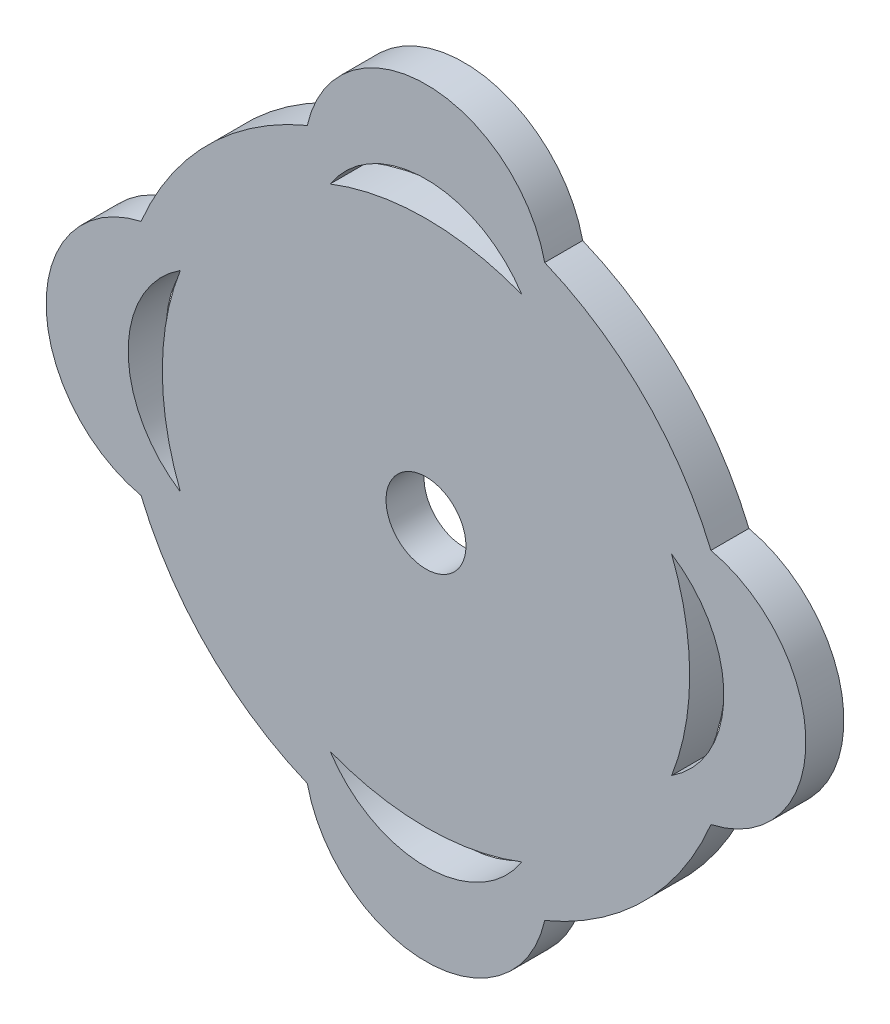
ISO-10303-21;
HEADER;
FILE_DESCRIPTION(('STEP AP214'),'2;1');
FILE_NAME('part.step','',(''),(''),'','','');
FILE_SCHEMA(('AUTOMOTIVE_DESIGN { 1 0 10303 214 1 1 1 1 }'));
ENDSEC;
DATA;
#1=APPLICATION_CONTEXT('core data for automotive mechanical design processes');
#2=APPLICATION_PROTOCOL_DEFINITION('international standard','automotive_design',2000,#1);
#3=PRODUCT_CONTEXT('',#1,'mechanical');
#4=PRODUCT('Part','Part','',(#3));
#5=PRODUCT_RELATED_PRODUCT_CATEGORY('part','',(#4));
#6=PRODUCT_DEFINITION_FORMATION('','',#4);
#7=PRODUCT_DEFINITION_CONTEXT('part definition',#1,'design');
#8=PRODUCT_DEFINITION('design','',#6,#7);
#9=PRODUCT_DEFINITION_SHAPE('','',#8);
#10=(LENGTH_UNIT() NAMED_UNIT(*) SI_UNIT(.MILLI.,.METRE.));
#11=(NAMED_UNIT(*) PLANE_ANGLE_UNIT() SI_UNIT($,.RADIAN.));
#12=(NAMED_UNIT(*) SI_UNIT($,.STERADIAN.) SOLID_ANGLE_UNIT());
#13=UNCERTAINTY_MEASURE_WITH_UNIT(LENGTH_MEASURE(1.E-05),#10,'distance_accuracy_value','');
#14=(GEOMETRIC_REPRESENTATION_CONTEXT(3) GLOBAL_UNCERTAINTY_ASSIGNED_CONTEXT((#13)) GLOBAL_UNIT_ASSIGNED_CONTEXT((#10,
#11,#12)) REPRESENTATION_CONTEXT('',''));
#15=CARTESIAN_POINT('',(0.,0.,0.));
#16=DIRECTION('',(0.,0.,1.));
#17=DIRECTION('',(1.,0.,0.));
#18=AXIS2_PLACEMENT_3D('',#15,#16,#17);
#19=CARTESIAN_POINT('',(0.,0.,1.03632));
#20=DIRECTION('',(0.,0.,1.));
#21=DIRECTION('',(1.,0.,0.));
#22=AXIS2_PLACEMENT_3D('',#19,#20,#21);
#23=PLANE('',#22);
#24=CARTESIAN_POINT('',(0.,0.,1.03632));
#25=DIRECTION('',(0.,0.,1.));
#26=DIRECTION('',(1.,0.,0.));
#27=AXIS2_PLACEMENT_3D('',#24,#25,#26);
#28=CIRCLE('',#27,1.11125);
#29=CARTESIAN_POINT('',(1.11125,0.,1.03632));
#30=VERTEX_POINT('',#29);
#31=EDGE_CURVE('E174',#30,#30,#28,.T.);
#32=ORIENTED_EDGE('',*,*,#31,.F.);
#33=EDGE_LOOP('',(#32));
#34=FACE_BOUND('',#33,.T.);
#35=CARTESIAN_POINT('',(7.18185,0.,1.03632));
#36=DIRECTION('',(0.,0.,1.));
#37=DIRECTION('',(1.,0.,0.));
#38=AXIS2_PLACEMENT_3D('',#35,#36,#37);
#39=CIRCLE('',#38,3.38455);
#40=CARTESIAN_POINT('',(7.9248,-3.302,1.03632));
#41=VERTEX_POINT('',#40);
#42=CARTESIAN_POINT('',(7.9248,3.302,1.03632));
#43=VERTEX_POINT('',#42);
#44=EDGE_CURVE('E228',#41,#43,#39,.T.);
#45=ORIENTED_EDGE('',*,*,#44,.T.);
#46=CARTESIAN_POINT('',(0.,0.,1.03632));
#47=DIRECTION('',(0.,0.,1.));
#48=DIRECTION('',(1.,0.,0.));
#49=AXIS2_PLACEMENT_3D('',#46,#47,#48);
#50=CIRCLE('',#49,8.5852);
#51=CARTESIAN_POINT('',(3.30200000000008,7.92479999999996,1.03632));
#52=VERTEX_POINT('',#51);
#53=EDGE_CURVE('E231',#43,#52,#50,.T.);
#54=ORIENTED_EDGE('',*,*,#53,.T.);
#55=CARTESIAN_POINT('',(0.,7.18185,1.03632));
#56=DIRECTION('',(0.,0.,1.));
#57=DIRECTION('',(1.,0.,0.));
#58=AXIS2_PLACEMENT_3D('',#55,#56,#57);
#59=CIRCLE('',#58,3.38455);
#60=CARTESIAN_POINT('',(-3.30199999999992,7.92480000000003,1.03632));
#61=VERTEX_POINT('',#60);
#62=EDGE_CURVE('E234',#52,#61,#59,.T.);
#63=ORIENTED_EDGE('',*,*,#62,.T.);
#64=CARTESIAN_POINT('',(-7.9248,3.30200000000004,1.03632));
#65=VERTEX_POINT('',#64);
#66=EDGE_CURVE('E236',#61,#65,#50,.T.);
#67=ORIENTED_EDGE('',*,*,#66,.T.);
#68=CARTESIAN_POINT('',(-7.18185,0.,1.03632));
#69=DIRECTION('',(0.,0.,1.));
#70=DIRECTION('',(1.,0.,0.));
#71=AXIS2_PLACEMENT_3D('',#68,#69,#70);
#72=CIRCLE('',#71,3.38455);
#73=CARTESIAN_POINT('',(-7.9248,-3.30199999999996,1.03632));
#74=VERTEX_POINT('',#73);
#75=EDGE_CURVE('E238',#65,#74,#72,.T.);
#76=ORIENTED_EDGE('',*,*,#75,.T.);
#77=CARTESIAN_POINT('',(-3.30200000000003,-7.92479999999999,1.03632));
#78=VERTEX_POINT('',#77);
#79=EDGE_CURVE('E240',#74,#78,#50,.T.);
#80=ORIENTED_EDGE('',*,*,#79,.T.);
#81=CARTESIAN_POINT('',(0.,-7.18185,1.03632));
#82=DIRECTION('',(0.,0.,1.));
#83=DIRECTION('',(1.,0.,0.));
#84=AXIS2_PLACEMENT_3D('',#81,#82,#83);
#85=CIRCLE('',#84,3.38455);
#86=CARTESIAN_POINT('',(3.30199999999997,-7.92480000000001,1.03632));
#87=VERTEX_POINT('',#86);
#88=EDGE_CURVE('E241',#78,#87,#85,.T.);
#89=ORIENTED_EDGE('',*,*,#88,.T.);
#90=EDGE_CURVE('E235',#87,#41,#50,.T.);
#91=ORIENTED_EDGE('',*,*,#90,.T.);
#92=EDGE_LOOP('',(#45,#54,#63,#67,#76,#80,#89,#91));
#93=FACE_BOUND('',#92,.T.);
#94=CARTESIAN_POINT('',(-5.10944260748974,0.,1.03632));
#95=DIRECTION('',(0.,0.,1.));
#96=DIRECTION('',(1.,0.,0.));
#97=AXIS2_PLACEMENT_3D('',#94,#95,#96);
#98=CIRCLE('',#97,3.175);
#99=CARTESIAN_POINT('',(-6.83215442320356,2.667,1.03632));
#100=VERTEX_POINT('',#99);
#101=CARTESIAN_POINT('',(-6.83215442320356,-2.667,1.03632));
#102=VERTEX_POINT('',#101);
#103=EDGE_CURVE('E210',#100,#102,#98,.T.);
#104=ORIENTED_EDGE('',*,*,#103,.F.);
#105=CARTESIAN_POINT('',(0.,0.,1.03632));
#106=DIRECTION('',(0.,0.,1.));
#107=DIRECTION('',(1.,0.,0.));
#108=AXIS2_PLACEMENT_3D('',#105,#106,#107);
#109=CIRCLE('',#108,7.33425);
#110=EDGE_CURVE('E214',#100,#102,#109,.T.);
#111=ORIENTED_EDGE('',*,*,#110,.T.);
#112=EDGE_LOOP('',(#104,#111));
#113=FACE_BOUND('',#112,.T.);
#114=CARTESIAN_POINT('',(0.,0.,1.03632));
#115=DIRECTION('',(0.,0.,1.));
#116=DIRECTION('',(1.,0.,0.));
#117=AXIS2_PLACEMENT_3D('',#114,#115,#116);
#118=CIRCLE('',#117,7.33425);
#119=CARTESIAN_POINT('',(-2.66700000000003,-6.83215442320355,1.03632));
#120=VERTEX_POINT('',#119);
#121=CARTESIAN_POINT('',(2.66699999999998,-6.83215442320357,1.03632));
#122=VERTEX_POINT('',#121);
#123=EDGE_CURVE('E193',#120,#122,#118,.T.);
#124=ORIENTED_EDGE('',*,*,#123,.T.);
#125=CARTESIAN_POINT('',(0.,-5.10944260748974,1.03632));
#126=DIRECTION('',(0.,0.,1.));
#127=DIRECTION('',(1.,0.,0.));
#128=AXIS2_PLACEMENT_3D('',#125,#126,#127);
#129=CIRCLE('',#128,3.175);
#130=EDGE_CURVE('E196',#122,#120,#129,.F.);
#131=ORIENTED_EDGE('',*,*,#130,.T.);
#132=EDGE_LOOP('',(#124,#131));
#133=FACE_BOUND('',#132,.T.);
#134=CARTESIAN_POINT('',(0.,0.,1.03632));
#135=DIRECTION('',(0.,0.,1.));
#136=DIRECTION('',(1.,0.,0.));
#137=AXIS2_PLACEMENT_3D('',#134,#135,#136);
#138=CIRCLE('',#137,7.33425);
#139=CARTESIAN_POINT('',(6.83215442320356,-2.667,1.03632));
#140=VERTEX_POINT('',#139);
#141=CARTESIAN_POINT('',(6.83215442320356,2.667,1.03632));
#142=VERTEX_POINT('',#141);
#143=EDGE_CURVE('E180',#140,#142,#138,.T.);
#144=ORIENTED_EDGE('',*,*,#143,.T.);
#145=CARTESIAN_POINT('',(5.10944260748975,0.,1.03632));
#146=DIRECTION('',(0.,0.,1.));
#147=DIRECTION('',(1.,0.,0.));
#148=AXIS2_PLACEMENT_3D('',#145,#146,#147);
#149=CIRCLE('',#148,3.175);
#150=EDGE_CURVE('E62',#142,#140,#149,.F.);
#151=ORIENTED_EDGE('',*,*,#150,.T.);
#152=EDGE_LOOP('',(#144,#151));
#153=FACE_BOUND('',#152,.T.);
#154=CARTESIAN_POINT('',(0.,0.,1.03632));
#155=DIRECTION('',(0.,0.,1.));
#156=DIRECTION('',(1.,0.,0.));
#157=AXIS2_PLACEMENT_3D('',#154,#155,#156);
#158=CIRCLE('',#157,7.33425);
#159=CARTESIAN_POINT('',(2.66700000000007,6.83215442320353,1.03632));
#160=VERTEX_POINT('',#159);
#161=CARTESIAN_POINT('',(-2.66699999999993,6.83215442320359,1.03632));
#162=VERTEX_POINT('',#161);
#163=EDGE_CURVE('E168',#160,#162,#158,.T.);
#164=ORIENTED_EDGE('',*,*,#163,.T.);
#165=CARTESIAN_POINT('',(0.,5.10944260748975,1.03632));
#166=DIRECTION('',(0.,0.,1.));
#167=DIRECTION('',(1.,0.,0.));
#168=AXIS2_PLACEMENT_3D('',#165,#166,#167);
#169=CIRCLE('',#168,3.175);
#170=EDGE_CURVE('E54',#162,#160,#169,.F.);
#171=ORIENTED_EDGE('',*,*,#170,.T.);
#172=EDGE_LOOP('',(#164,#171));
#173=FACE_BOUND('',#172,.T.);
#174=ADVANCED_FACE('F39',(#34,#93,#113,#133,#153,#173),#23,.T.);
#175=CARTESIAN_POINT('',(0.,0.,-0.02032));
#176=DIRECTION('',(0.,0.,1.));
#177=DIRECTION('',(1.,0.,0.));
#178=AXIS2_PLACEMENT_3D('',#175,#176,#177);
#179=PLANE('',#178);
#180=CARTESIAN_POINT('',(5.10944260748975,0.,-0.0203200000000001));
#181=DIRECTION('',(0.,0.,1.));
#182=DIRECTION('',(1.,0.,0.));
#183=AXIS2_PLACEMENT_3D('',#180,#181,#182);
#184=CIRCLE('',#183,3.175);
#185=CARTESIAN_POINT('',(6.83215442320356,2.667,-0.0203200000000001));
#186=VERTEX_POINT('',#185);
#187=CARTESIAN_POINT('',(6.83215442320356,-2.667,-0.02032));
#188=VERTEX_POINT('',#187);
#189=EDGE_CURVE('E176',#186,#188,#184,.F.);
#190=ORIENTED_EDGE('',*,*,#189,.F.);
#191=CARTESIAN_POINT('',(0.,0.,-0.0203200000000001));
#192=DIRECTION('',(0.,0.,1.));
#193=DIRECTION('',(1.,0.,0.));
#194=AXIS2_PLACEMENT_3D('',#191,#192,#193);
#195=CIRCLE('',#194,7.33425);
#196=EDGE_CURVE('E179',#188,#186,#195,.T.);
#197=ORIENTED_EDGE('',*,*,#196,.F.);
#198=EDGE_LOOP('',(#190,#197));
#199=FACE_BOUND('',#198,.T.);
#200=CARTESIAN_POINT('',(0.,0.,-0.0203200000000001));
#201=DIRECTION('',(0.,0.,1.));
#202=DIRECTION('',(1.,0.,0.));
#203=AXIS2_PLACEMENT_3D('',#200,#201,#202);
#204=CIRCLE('',#203,7.33425);
#205=CARTESIAN_POINT('',(-6.83215442320356,2.667,-0.0203200000000001));
#206=VERTEX_POINT('',#205);
#207=CARTESIAN_POINT('',(-6.83215442320356,-2.667,-0.02032));
#208=VERTEX_POINT('',#207);
#209=EDGE_CURVE('E206',#206,#208,#204,.T.);
#210=ORIENTED_EDGE('',*,*,#209,.F.);
#211=CARTESIAN_POINT('',(-5.10944260748974,0.,-0.0203200000000001));
#212=DIRECTION('',(0.,0.,1.));
#213=DIRECTION('',(1.,0.,0.));
#214=AXIS2_PLACEMENT_3D('',#211,#212,#213);
#215=CIRCLE('',#214,3.175);
#216=EDGE_CURVE('E209',#206,#208,#215,.T.);
#217=ORIENTED_EDGE('',*,*,#216,.T.);
#218=EDGE_LOOP('',(#210,#217));
#219=FACE_BOUND('',#218,.T.);
#220=CARTESIAN_POINT('',(0.,0.,-0.0203200000000001));
#221=DIRECTION('',(0.,0.,1.));
#222=DIRECTION('',(1.,0.,0.));
#223=AXIS2_PLACEMENT_3D('',#220,#221,#222);
#224=CIRCLE('',#223,1.11125);
#225=CARTESIAN_POINT('',(1.11125,0.,-0.0203200000000001));
#226=VERTEX_POINT('',#225);
#227=EDGE_CURVE('E222',#226,#226,#224,.T.);
#228=ORIENTED_EDGE('',*,*,#227,.T.);
#229=EDGE_LOOP('',(#228));
#230=FACE_BOUND('',#229,.T.);
#231=CARTESIAN_POINT('',(7.18185,0.,-0.02032));
#232=DIRECTION('',(0.,0.,1.));
#233=DIRECTION('',(1.,0.,0.));
#234=AXIS2_PLACEMENT_3D('',#231,#232,#233);
#235=CIRCLE('',#234,3.38455);
#236=CARTESIAN_POINT('',(7.9248,-3.302,-0.02032));
#237=VERTEX_POINT('',#236);
#238=CARTESIAN_POINT('',(7.9248,3.302,-0.02032));
#239=VERTEX_POINT('',#238);
#240=EDGE_CURVE('E225',#237,#239,#235,.T.);
#241=ORIENTED_EDGE('',*,*,#240,.F.);
#242=CARTESIAN_POINT('',(0.,0.,-0.02032));
#243=DIRECTION('',(0.,0.,1.));
#244=DIRECTION('',(1.,0.,0.));
#245=AXIS2_PLACEMENT_3D('',#242,#243,#244);
#246=CIRCLE('',#245,8.5852);
#247=CARTESIAN_POINT('',(3.30199999999997,-7.92480000000001,-0.02032));
#248=VERTEX_POINT('',#247);
#249=EDGE_CURVE('E232',#248,#237,#246,.T.);
#250=ORIENTED_EDGE('',*,*,#249,.F.);
#251=CARTESIAN_POINT('',(0.,-7.18185,-0.02032));
#252=DIRECTION('',(0.,0.,1.));
#253=DIRECTION('',(1.,0.,0.));
#254=AXIS2_PLACEMENT_3D('',#251,#252,#253);
#255=CIRCLE('',#254,3.38455);
#256=CARTESIAN_POINT('',(-3.30200000000003,-7.92479999999999,-0.02032));
#257=VERTEX_POINT('',#256);
#258=EDGE_CURVE('E253',#257,#248,#255,.T.);
#259=ORIENTED_EDGE('',*,*,#258,.F.);
#260=CARTESIAN_POINT('',(-7.9248,-3.30199999999996,-0.02032));
#261=VERTEX_POINT('',#260);
#262=EDGE_CURVE('E252',#261,#257,#246,.T.);
#263=ORIENTED_EDGE('',*,*,#262,.F.);
#264=CARTESIAN_POINT('',(-7.18185,0.,-0.02032));
#265=DIRECTION('',(0.,0.,1.));
#266=DIRECTION('',(1.,0.,0.));
#267=AXIS2_PLACEMENT_3D('',#264,#265,#266);
#268=CIRCLE('',#267,3.38455);
#269=CARTESIAN_POINT('',(-7.9248,3.30200000000004,-0.02032));
#270=VERTEX_POINT('',#269);
#271=EDGE_CURVE('E250',#270,#261,#268,.T.);
#272=ORIENTED_EDGE('',*,*,#271,.F.);
#273=CARTESIAN_POINT('',(-3.30199999999992,7.92480000000003,-0.02032));
#274=VERTEX_POINT('',#273);
#275=EDGE_CURVE('E248',#274,#270,#246,.T.);
#276=ORIENTED_EDGE('',*,*,#275,.F.);
#277=CARTESIAN_POINT('',(0.,7.18185,-0.02032));
#278=DIRECTION('',(0.,0.,1.));
#279=DIRECTION('',(1.,0.,0.));
#280=AXIS2_PLACEMENT_3D('',#277,#278,#279);
#281=CIRCLE('',#280,3.38455);
#282=CARTESIAN_POINT('',(3.30200000000008,7.92479999999996,-0.02032));
#283=VERTEX_POINT('',#282);
#284=EDGE_CURVE('E247',#283,#274,#281,.T.);
#285=ORIENTED_EDGE('',*,*,#284,.F.);
#286=EDGE_CURVE('E245',#239,#283,#246,.T.);
#287=ORIENTED_EDGE('',*,*,#286,.F.);
#288=EDGE_LOOP('',(#241,#250,#259,#263,#272,#276,#285,#287));
#289=FACE_BOUND('',#288,.T.);
#290=CARTESIAN_POINT('',(0.,-5.10944260748974,-0.0203200000000001));
#291=DIRECTION('',(0.,0.,1.));
#292=DIRECTION('',(1.,0.,0.));
#293=AXIS2_PLACEMENT_3D('',#290,#291,#292);
#294=CIRCLE('',#293,3.175);
#295=CARTESIAN_POINT('',(2.66699999999998,-6.83215442320357,-0.0203200000000001));
#296=VERTEX_POINT('',#295);
#297=CARTESIAN_POINT('',(-2.66700000000003,-6.83215442320355,-0.02032));
#298=VERTEX_POINT('',#297);
#299=EDGE_CURVE('E189',#296,#298,#294,.F.);
#300=ORIENTED_EDGE('',*,*,#299,.F.);
#301=CARTESIAN_POINT('',(0.,0.,-0.0203200000000001));
#302=DIRECTION('',(0.,0.,1.));
#303=DIRECTION('',(1.,0.,0.));
#304=AXIS2_PLACEMENT_3D('',#301,#302,#303);
#305=CIRCLE('',#304,7.33425);
#306=EDGE_CURVE('E192',#298,#296,#305,.T.);
#307=ORIENTED_EDGE('',*,*,#306,.F.);
#308=EDGE_LOOP('',(#300,#307));
#309=FACE_BOUND('',#308,.T.);
#310=CARTESIAN_POINT('',(0.,5.10944260748975,-0.0203200000000001));
#311=DIRECTION('',(0.,0.,1.));
#312=DIRECTION('',(1.,0.,0.));
#313=AXIS2_PLACEMENT_3D('',#310,#311,#312);
#314=CIRCLE('',#313,3.175);
#315=CARTESIAN_POINT('',(-2.66699999999993,6.83215442320359,-0.0203200000000001));
#316=VERTEX_POINT('',#315);
#317=CARTESIAN_POINT('',(2.66700000000007,6.83215442320353,-0.02032));
#318=VERTEX_POINT('',#317);
#319=EDGE_CURVE('E163',#316,#318,#314,.F.);
#320=ORIENTED_EDGE('',*,*,#319,.F.);
#321=CARTESIAN_POINT('',(0.,0.,-0.0203200000000001));
#322=DIRECTION('',(0.,0.,1.));
#323=DIRECTION('',(1.,0.,0.));
#324=AXIS2_PLACEMENT_3D('',#321,#322,#323);
#325=CIRCLE('',#324,7.33425);
#326=EDGE_CURVE('E155',#318,#316,#325,.T.);
#327=ORIENTED_EDGE('',*,*,#326,.F.);
#328=EDGE_LOOP('',(#320,#327));
#329=FACE_BOUND('',#328,.T.);
#330=ADVANCED_FACE('F167',(#199,#219,#230,#289,#309,#329),#179,.F.);
#331=CARTESIAN_POINT('',(7.18185,0.,1.03632));
#332=DIRECTION('',(0.,0.,-1.));
#333=DIRECTION('',(-1.,0.,0.));
#334=AXIS2_PLACEMENT_3D('',#331,#332,#333);
#335=CYLINDRICAL_SURFACE('',#334,3.38455);
#336=ORIENTED_EDGE('',*,*,#240,.T.);
#337=DIRECTION('',(0.,0.,-1.));
#338=VECTOR('',#337,1.);
#339=CARTESIAN_POINT('',(7.9248,3.302,1.03632));
#340=LINE('',#339,#338);
#341=EDGE_CURVE('E11',#43,#239,#340,.T.);
#342=ORIENTED_EDGE('',*,*,#341,.F.);
#343=ORIENTED_EDGE('',*,*,#44,.F.);
#344=DIRECTION('',(0.,0.,-1.));
#345=VECTOR('',#344,1.);
#346=CARTESIAN_POINT('',(7.9248,-3.302,1.03632));
#347=LINE('',#346,#345);
#348=EDGE_CURVE('E255',#41,#237,#347,.T.);
#349=ORIENTED_EDGE('',*,*,#348,.T.);
#350=EDGE_LOOP('',(#336,#342,#343,#349));
#351=FACE_BOUND('',#350,.T.);
#352=ADVANCED_FACE('F41',(#351),#335,.T.);
#353=CARTESIAN_POINT('',(0.,0.,1.03632));
#354=DIRECTION('',(0.,0.,-1.));
#355=DIRECTION('',(-1.,0.,0.));
#356=AXIS2_PLACEMENT_3D('',#353,#354,#355);
#357=CYLINDRICAL_SURFACE('',#356,8.5852);
#358=ORIENTED_EDGE('',*,*,#286,.T.);
#359=DIRECTION('',(0.,0.,-1.));
#360=VECTOR('',#359,1.);
#361=CARTESIAN_POINT('',(3.30200000000008,7.92479999999996,1.03632));
#362=LINE('',#361,#360);
#363=EDGE_CURVE('E47',#52,#283,#362,.T.);
#364=ORIENTED_EDGE('',*,*,#363,.F.);
#365=ORIENTED_EDGE('',*,*,#53,.F.);
#366=ORIENTED_EDGE('',*,*,#341,.T.);
#367=EDGE_LOOP('',(#358,#364,#365,#366));
#368=FACE_BOUND('',#367,.T.);
#369=ADVANCED_FACE('F321',(#368),#357,.T.);
#370=CARTESIAN_POINT('',(0.,7.18185,1.03632));
#371=DIRECTION('',(0.,0.,-1.));
#372=DIRECTION('',(-1.,0.,0.));
#373=AXIS2_PLACEMENT_3D('',#370,#371,#372);
#374=CYLINDRICAL_SURFACE('',#373,3.38455);
#375=ORIENTED_EDGE('',*,*,#284,.T.);
#376=DIRECTION('',(0.,0.,-1.));
#377=VECTOR('',#376,1.);
#378=CARTESIAN_POINT('',(-3.30199999999992,7.92480000000003,1.03632));
#379=LINE('',#378,#377);
#380=EDGE_CURVE('E270',#61,#274,#379,.T.);
#381=ORIENTED_EDGE('',*,*,#380,.F.);
#382=ORIENTED_EDGE('',*,*,#62,.F.);
#383=ORIENTED_EDGE('',*,*,#363,.T.);
#384=EDGE_LOOP('',(#375,#381,#382,#383));
#385=FACE_BOUND('',#384,.T.);
#386=ADVANCED_FACE('F277',(#385),#374,.T.);
#387=ORIENTED_EDGE('',*,*,#275,.T.);
#388=DIRECTION('',(0.,0.,-1.));
#389=VECTOR('',#388,1.);
#390=CARTESIAN_POINT('',(-7.9248,3.30200000000004,1.03632));
#391=LINE('',#390,#389);
#392=EDGE_CURVE('E267',#65,#270,#391,.T.);
#393=ORIENTED_EDGE('',*,*,#392,.F.);
#394=ORIENTED_EDGE('',*,*,#66,.F.);
#395=ORIENTED_EDGE('',*,*,#380,.T.);
#396=EDGE_LOOP('',(#387,#393,#394,#395));
#397=FACE_BOUND('',#396,.T.);
#398=ADVANCED_FACE('F307',(#397),#357,.T.);
#399=CARTESIAN_POINT('',(-7.18185,0.,1.03632));
#400=DIRECTION('',(0.,0.,-1.));
#401=DIRECTION('',(-1.,0.,0.));
#402=AXIS2_PLACEMENT_3D('',#399,#400,#401);
#403=CYLINDRICAL_SURFACE('',#402,3.38455);
#404=ORIENTED_EDGE('',*,*,#271,.T.);
#405=DIRECTION('',(0.,0.,-1.));
#406=VECTOR('',#405,1.);
#407=CARTESIAN_POINT('',(-7.9248,-3.30199999999996,1.03632));
#408=LINE('',#407,#406);
#409=EDGE_CURVE('E264',#74,#261,#408,.T.);
#410=ORIENTED_EDGE('',*,*,#409,.F.);
#411=ORIENTED_EDGE('',*,*,#75,.F.);
#412=ORIENTED_EDGE('',*,*,#392,.T.);
#413=EDGE_LOOP('',(#404,#410,#411,#412));
#414=FACE_BOUND('',#413,.T.);
#415=ADVANCED_FACE('F309',(#414),#403,.T.);
#416=ORIENTED_EDGE('',*,*,#262,.T.);
#417=DIRECTION('',(0.,0.,-1.));
#418=VECTOR('',#417,1.);
#419=CARTESIAN_POINT('',(-3.30200000000003,-7.92479999999999,1.03632));
#420=LINE('',#419,#418);
#421=EDGE_CURVE('E261',#78,#257,#420,.T.);
#422=ORIENTED_EDGE('',*,*,#421,.F.);
#423=ORIENTED_EDGE('',*,*,#79,.F.);
#424=ORIENTED_EDGE('',*,*,#409,.T.);
#425=EDGE_LOOP('',(#416,#422,#423,#424));
#426=FACE_BOUND('',#425,.T.);
#427=ADVANCED_FACE('F310',(#426),#357,.T.);
#428=CARTESIAN_POINT('',(0.,-7.18185,1.03632));
#429=DIRECTION('',(0.,0.,-1.));
#430=DIRECTION('',(-1.,0.,0.));
#431=AXIS2_PLACEMENT_3D('',#428,#429,#430);
#432=CYLINDRICAL_SURFACE('',#431,3.38455);
#433=ORIENTED_EDGE('',*,*,#258,.T.);
#434=DIRECTION('',(0.,0.,-1.));
#435=VECTOR('',#434,1.);
#436=CARTESIAN_POINT('',(3.30199999999997,-7.92480000000001,1.03632));
#437=LINE('',#436,#435);
#438=EDGE_CURVE('E258',#87,#248,#437,.T.);
#439=ORIENTED_EDGE('',*,*,#438,.F.);
#440=ORIENTED_EDGE('',*,*,#88,.F.);
#441=ORIENTED_EDGE('',*,*,#421,.T.);
#442=EDGE_LOOP('',(#433,#439,#440,#441));
#443=FACE_BOUND('',#442,.T.);
#444=ADVANCED_FACE('F312',(#443),#432,.T.);
#445=ORIENTED_EDGE('',*,*,#249,.T.);
#446=ORIENTED_EDGE('',*,*,#348,.F.);
#447=ORIENTED_EDGE('',*,*,#90,.F.);
#448=ORIENTED_EDGE('',*,*,#438,.T.);
#449=EDGE_LOOP('',(#445,#446,#447,#448));
#450=FACE_BOUND('',#449,.T.);
#451=ADVANCED_FACE('F293',(#450),#357,.T.);
#452=CARTESIAN_POINT('',(0.,0.,-0.0203200000000001));
#453=DIRECTION('',(0.,0.,1.));
#454=DIRECTION('',(1.,0.,0.));
#455=AXIS2_PLACEMENT_3D('',#452,#453,#454);
#456=CYLINDRICAL_SURFACE('',#455,1.11125);
#457=ORIENTED_EDGE('',*,*,#227,.F.);
#458=EDGE_LOOP('',(#457));
#459=FACE_BOUND('',#458,.T.);
#460=ORIENTED_EDGE('',*,*,#31,.T.);
#461=EDGE_LOOP('',(#460));
#462=FACE_BOUND('',#461,.T.);
#463=ADVANCED_FACE('F319',(#459,#462),#456,.F.);
#464=CARTESIAN_POINT('',(0.,0.,-0.0203200000000001));
#465=DIRECTION('',(0.,0.,1.));
#466=DIRECTION('',(1.,0.,0.));
#467=AXIS2_PLACEMENT_3D('',#464,#465,#466);
#468=CYLINDRICAL_SURFACE('',#467,7.33425);
#469=ORIENTED_EDGE('',*,*,#110,.F.);
#470=DIRECTION('',(0.,0.,1.));
#471=VECTOR('',#470,1.);
#472=CARTESIAN_POINT('',(-6.83215442320356,2.667,-0.0203200000000001));
#473=LINE('',#472,#471);
#474=EDGE_CURVE('E213',#206,#100,#473,.T.);
#475=ORIENTED_EDGE('',*,*,#474,.F.);
#476=ORIENTED_EDGE('',*,*,#209,.T.);
#477=DIRECTION('',(0.,0.,1.));
#478=VECTOR('',#477,1.);
#479=CARTESIAN_POINT('',(-6.83215442320356,-2.667,-0.0203200000000001));
#480=LINE('',#479,#478);
#481=EDGE_CURVE('E199',#208,#102,#480,.T.);
#482=ORIENTED_EDGE('',*,*,#481,.T.);
#483=EDGE_LOOP('',(#469,#475,#476,#482));
#484=FACE_BOUND('',#483,.T.);
#485=ADVANCED_FACE('F335',(#484),#468,.T.);
#486=CARTESIAN_POINT('',(-5.10944260748974,0.,-0.0203200000000001));
#487=DIRECTION('',(0.,0.,1.));
#488=DIRECTION('',(1.,0.,0.));
#489=AXIS2_PLACEMENT_3D('',#486,#487,#488);
#490=CYLINDRICAL_SURFACE('',#489,3.175);
#491=ORIENTED_EDGE('',*,*,#103,.T.);
#492=ORIENTED_EDGE('',*,*,#481,.F.);
#493=ORIENTED_EDGE('',*,*,#216,.F.);
#494=ORIENTED_EDGE('',*,*,#474,.T.);
#495=EDGE_LOOP('',(#491,#492,#493,#494));
#496=FACE_BOUND('',#495,.T.);
#497=ADVANCED_FACE('F339',(#496),#490,.F.);
#498=CARTESIAN_POINT('',(0.,-5.10944260748974,-0.0203200000000001));
#499=DIRECTION('',(0.,0.,1.));
#500=DIRECTION('',(1.,0.,0.));
#501=AXIS2_PLACEMENT_3D('',#498,#499,#500);
#502=CYLINDRICAL_SURFACE('',#501,3.175);
#503=ORIENTED_EDGE('',*,*,#130,.F.);
#504=DIRECTION('',(0.,0.,1.));
#505=VECTOR('',#504,1.);
#506=CARTESIAN_POINT('',(2.66699999999998,-6.83215442320357,-0.0203200000000001));
#507=LINE('',#506,#505);
#508=EDGE_CURVE('E195',#296,#122,#507,.T.);
#509=ORIENTED_EDGE('',*,*,#508,.F.);
#510=ORIENTED_EDGE('',*,*,#299,.T.);
#511=DIRECTION('',(0.,0.,1.));
#512=VECTOR('',#511,1.);
#513=CARTESIAN_POINT('',(-2.66700000000003,-6.83215442320355,-0.0203200000000001));
#514=LINE('',#513,#512);
#515=EDGE_CURVE('E184',#298,#120,#514,.T.);
#516=ORIENTED_EDGE('',*,*,#515,.T.);
#517=EDGE_LOOP('',(#503,#509,#510,#516));
#518=FACE_BOUND('',#517,.T.);
#519=ADVANCED_FACE('F343',(#518),#502,.F.);
#520=CARTESIAN_POINT('',(0.,0.,-0.0203200000000001));
#521=DIRECTION('',(0.,0.,1.));
#522=DIRECTION('',(1.,0.,0.));
#523=AXIS2_PLACEMENT_3D('',#520,#521,#522);
#524=CYLINDRICAL_SURFACE('',#523,7.33425);
#525=ORIENTED_EDGE('',*,*,#123,.F.);
#526=ORIENTED_EDGE('',*,*,#515,.F.);
#527=ORIENTED_EDGE('',*,*,#306,.T.);
#528=ORIENTED_EDGE('',*,*,#508,.T.);
#529=EDGE_LOOP('',(#525,#526,#527,#528));
#530=FACE_BOUND('',#529,.T.);
#531=ADVANCED_FACE('F347',(#530),#524,.T.);
#532=CARTESIAN_POINT('',(5.10944260748975,0.,-0.0203200000000001));
#533=DIRECTION('',(0.,0.,1.));
#534=DIRECTION('',(1.,0.,0.));
#535=AXIS2_PLACEMENT_3D('',#532,#533,#534);
#536=CYLINDRICAL_SURFACE('',#535,3.175);
#537=ORIENTED_EDGE('',*,*,#150,.F.);
#538=DIRECTION('',(0.,0.,1.));
#539=VECTOR('',#538,1.);
#540=CARTESIAN_POINT('',(6.83215442320356,2.667,-0.0203200000000001));
#541=LINE('',#540,#539);
#542=EDGE_CURVE('E182',#186,#142,#541,.T.);
#543=ORIENTED_EDGE('',*,*,#542,.F.);
#544=ORIENTED_EDGE('',*,*,#189,.T.);
#545=DIRECTION('',(0.,0.,1.));
#546=VECTOR('',#545,1.);
#547=CARTESIAN_POINT('',(6.83215442320356,-2.667,-0.0203200000000001));
#548=LINE('',#547,#546);
#549=EDGE_CURVE('E172',#188,#140,#548,.T.);
#550=ORIENTED_EDGE('',*,*,#549,.T.);
#551=EDGE_LOOP('',(#537,#543,#544,#550));
#552=FACE_BOUND('',#551,.T.);
#553=ADVANCED_FACE('F351',(#552),#536,.F.);
#554=CARTESIAN_POINT('',(0.,0.,-0.0203200000000001));
#555=DIRECTION('',(0.,0.,1.));
#556=DIRECTION('',(1.,0.,0.));
#557=AXIS2_PLACEMENT_3D('',#554,#555,#556);
#558=CYLINDRICAL_SURFACE('',#557,7.33425);
#559=ORIENTED_EDGE('',*,*,#143,.F.);
#560=ORIENTED_EDGE('',*,*,#549,.F.);
#561=ORIENTED_EDGE('',*,*,#196,.T.);
#562=ORIENTED_EDGE('',*,*,#542,.T.);
#563=EDGE_LOOP('',(#559,#560,#561,#562));
#564=FACE_BOUND('',#563,.T.);
#565=ADVANCED_FACE('F355',(#564),#558,.T.);
#566=CARTESIAN_POINT('',(0.,5.10944260748975,-0.0203200000000001));
#567=DIRECTION('',(0.,0.,1.));
#568=DIRECTION('',(1.,0.,0.));
#569=AXIS2_PLACEMENT_3D('',#566,#567,#568);
#570=CYLINDRICAL_SURFACE('',#569,3.175);
#571=ORIENTED_EDGE('',*,*,#170,.F.);
#572=DIRECTION('',(0.,0.,1.));
#573=VECTOR('',#572,1.);
#574=CARTESIAN_POINT('',(-2.66699999999993,6.83215442320359,-0.0203200000000001));
#575=LINE('',#574,#573);
#576=EDGE_CURVE('E157',#316,#162,#575,.T.);
#577=ORIENTED_EDGE('',*,*,#576,.F.);
#578=ORIENTED_EDGE('',*,*,#319,.T.);
#579=DIRECTION('',(0.,0.,1.));
#580=VECTOR('',#579,1.);
#581=CARTESIAN_POINT('',(2.66700000000007,6.83215442320353,-0.0203200000000001));
#582=LINE('',#581,#580);
#583=EDGE_CURVE('E159',#318,#160,#582,.T.);
#584=ORIENTED_EDGE('',*,*,#583,.T.);
#585=EDGE_LOOP('',(#571,#577,#578,#584));
#586=FACE_BOUND('',#585,.T.);
#587=ADVANCED_FACE('F165',(#586),#570,.F.);
#588=CARTESIAN_POINT('',(0.,0.,-0.0203200000000001));
#589=DIRECTION('',(0.,0.,1.));
#590=DIRECTION('',(1.,0.,0.));
#591=AXIS2_PLACEMENT_3D('',#588,#589,#590);
#592=CYLINDRICAL_SURFACE('',#591,7.33425);
#593=ORIENTED_EDGE('',*,*,#163,.F.);
#594=ORIENTED_EDGE('',*,*,#583,.F.);
#595=ORIENTED_EDGE('',*,*,#326,.T.);
#596=ORIENTED_EDGE('',*,*,#576,.T.);
#597=EDGE_LOOP('',(#593,#594,#595,#596));
#598=FACE_BOUND('',#597,.T.);
#599=ADVANCED_FACE('F156',(#598),#592,.T.);
#600=CLOSED_SHELL('',(#174,#330,#352,#369,#386,#398,#415,#427,#444,#451,#463,#485,#497,#519,
#531,#553,#565,#587,#599));
#601=MANIFOLD_SOLID_BREP('B2',#600);
#602=ADVANCED_BREP_SHAPE_REPRESENTATION('',(#18,#601),#14);
#603=SHAPE_DEFINITION_REPRESENTATION(#9,#602);
ENDSEC;
END-ISO-10303-21;
